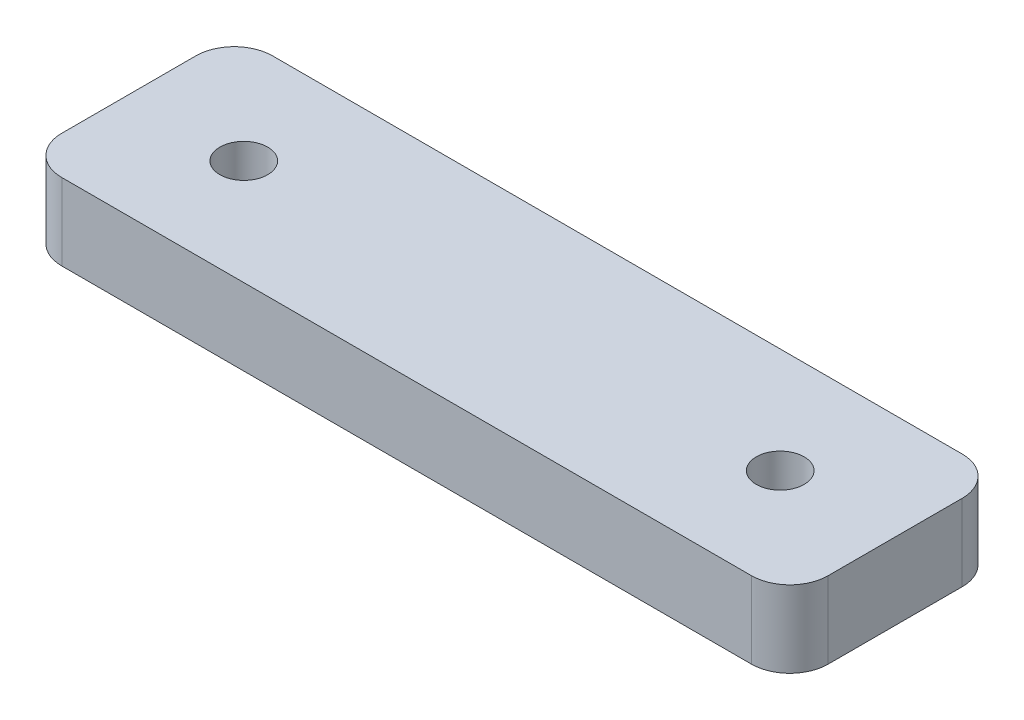
ISO-10303-21;
HEADER;
FILE_DESCRIPTION(('STEP AP214'),'2;1');
FILE_NAME('part.step','',(''),(''),'','','');
FILE_SCHEMA(('AUTOMOTIVE_DESIGN { 1 0 10303 214 1 1 1 1 }'));
ENDSEC;
DATA;
#1=APPLICATION_CONTEXT('core data for automotive mechanical design processes');
#2=APPLICATION_PROTOCOL_DEFINITION('international standard','automotive_design',2000,#1);
#3=PRODUCT_CONTEXT('',#1,'mechanical');
#4=PRODUCT('Part','Part','',(#3));
#5=PRODUCT_RELATED_PRODUCT_CATEGORY('part','',(#4));
#6=PRODUCT_DEFINITION_FORMATION('','',#4);
#7=PRODUCT_DEFINITION_CONTEXT('part definition',#1,'design');
#8=PRODUCT_DEFINITION('design','',#6,#7);
#9=PRODUCT_DEFINITION_SHAPE('','',#8);
#10=(LENGTH_UNIT() NAMED_UNIT(*) SI_UNIT(.MILLI.,.METRE.));
#11=(NAMED_UNIT(*) PLANE_ANGLE_UNIT() SI_UNIT($,.RADIAN.));
#12=(NAMED_UNIT(*) SI_UNIT($,.STERADIAN.) SOLID_ANGLE_UNIT());
#13=UNCERTAINTY_MEASURE_WITH_UNIT(LENGTH_MEASURE(1.E-05),#10,'distance_accuracy_value','');
#14=(GEOMETRIC_REPRESENTATION_CONTEXT(3) GLOBAL_UNCERTAINTY_ASSIGNED_CONTEXT((#13)) GLOBAL_UNIT_ASSIGNED_CONTEXT((#10,
#11,#12)) REPRESENTATION_CONTEXT('',''));
#15=CARTESIAN_POINT('',(0.,0.,0.));
#16=DIRECTION('',(0.,0.,1.));
#17=DIRECTION('',(1.,0.,0.));
#18=AXIS2_PLACEMENT_3D('',#15,#16,#17);
#19=CARTESIAN_POINT('',(0.,2.,0.));
#20=DIRECTION('',(0.,-1.,0.));
#21=DIRECTION('',(0.,0.,-1.));
#22=AXIS2_PLACEMENT_3D('',#19,#20,#21);
#23=PLANE('',#22);
#24=DIRECTION('',(0.,0.,-1.));
#25=VECTOR('',#24,1.);
#26=CARTESIAN_POINT('',(9.99999999999999,2.,2.75));
#27=LINE('',#26,#25);
#28=CARTESIAN_POINT('',(9.99999999999999,2.,1.75));
#29=VERTEX_POINT('',#28);
#30=CARTESIAN_POINT('',(9.99999999999999,2.,-1.75));
#31=VERTEX_POINT('',#30);
#32=EDGE_CURVE('E139',#29,#31,#27,.T.);
#33=ORIENTED_EDGE('',*,*,#32,.T.);
#34=CARTESIAN_POINT('',(8.99999999999999,2.,-1.75));
#35=DIRECTION('',(0.,-1.,0.));
#36=DIRECTION('',(0.,0.,-1.));
#37=AXIS2_PLACEMENT_3D('',#34,#35,#36);
#38=CIRCLE('',#37,1.);
#39=CARTESIAN_POINT('',(8.99999999999999,2.,-2.75));
#40=VERTEX_POINT('',#39);
#41=EDGE_CURVE('E153',#31,#40,#38,.F.);
#42=ORIENTED_EDGE('',*,*,#41,.T.);
#43=DIRECTION('',(-1.,0.,0.));
#44=VECTOR('',#43,1.);
#45=CARTESIAN_POINT('',(-10.,2.,-2.75));
#46=LINE('',#45,#44);
#47=CARTESIAN_POINT('',(-9.00000000000001,2.,-2.75));
#48=VERTEX_POINT('',#47);
#49=EDGE_CURVE('E120',#40,#48,#46,.T.);
#50=ORIENTED_EDGE('',*,*,#49,.T.);
#51=CARTESIAN_POINT('',(-9.00000000000001,2.,-1.75));
#52=DIRECTION('',(0.,-1.,0.));
#53=DIRECTION('',(0.,0.,-1.));
#54=AXIS2_PLACEMENT_3D('',#51,#52,#53);
#55=CIRCLE('',#54,1.);
#56=CARTESIAN_POINT('',(-10.,2.,-1.75));
#57=VERTEX_POINT('',#56);
#58=EDGE_CURVE('E149',#48,#57,#55,.F.);
#59=ORIENTED_EDGE('',*,*,#58,.T.);
#60=DIRECTION('',(0.,0.,1.));
#61=VECTOR('',#60,1.);
#62=CARTESIAN_POINT('',(-10.,2.,2.75));
#63=LINE('',#62,#61);
#64=CARTESIAN_POINT('',(-10.,2.,1.75));
#65=VERTEX_POINT('',#64);
#66=EDGE_CURVE('E162',#57,#65,#63,.T.);
#67=ORIENTED_EDGE('',*,*,#66,.T.);
#68=CARTESIAN_POINT('',(-9.00000000000001,2.,1.75));
#69=DIRECTION('',(0.,-1.,0.));
#70=DIRECTION('',(0.,0.,-1.));
#71=AXIS2_PLACEMENT_3D('',#68,#69,#70);
#72=CIRCLE('',#71,1.);
#73=CARTESIAN_POINT('',(-9.00000000000001,2.,2.75));
#74=VERTEX_POINT('',#73);
#75=EDGE_CURVE('E55',#65,#74,#72,.F.);
#76=ORIENTED_EDGE('',*,*,#75,.T.);
#77=DIRECTION('',(1.,0.,0.));
#78=VECTOR('',#77,1.);
#79=CARTESIAN_POINT('',(-10.,2.,2.75));
#80=LINE('',#79,#78);
#81=CARTESIAN_POINT('',(8.99999999999999,2.,2.75));
#82=VERTEX_POINT('',#81);
#83=EDGE_CURVE('E140',#74,#82,#80,.T.);
#84=ORIENTED_EDGE('',*,*,#83,.T.);
#85=CARTESIAN_POINT('',(8.99999999999999,2.,1.75));
#86=DIRECTION('',(0.,-1.,0.));
#87=DIRECTION('',(0.,0.,-1.));
#88=AXIS2_PLACEMENT_3D('',#85,#86,#87);
#89=CIRCLE('',#88,1.);
#90=EDGE_CURVE('E151',#82,#29,#89,.F.);
#91=ORIENTED_EDGE('',*,*,#90,.T.);
#92=EDGE_LOOP('',(#33,#42,#50,#59,#67,#76,#84,#91));
#93=FACE_BOUND('',#92,.T.);
#94=CARTESIAN_POINT('',(-7.00000000000001,2.,0.));
#95=DIRECTION('',(0.,1.,0.));
#96=DIRECTION('',(0.,0.,1.));
#97=AXIS2_PLACEMENT_3D('',#94,#95,#96);
#98=CIRCLE('',#97,0.625000000000001);
#99=CARTESIAN_POINT('',(-7.00000000000001,2.,0.625000000000001));
#100=VERTEX_POINT('',#99);
#101=EDGE_CURVE('E134',#100,#100,#98,.T.);
#102=ORIENTED_EDGE('',*,*,#101,.F.);
#103=EDGE_LOOP('',(#102));
#104=FACE_BOUND('',#103,.T.);
#105=CARTESIAN_POINT('',(7.00000000000001,2.,0.));
#106=DIRECTION('',(0.,1.,0.));
#107=DIRECTION('',(0.,0.,-1.));
#108=AXIS2_PLACEMENT_3D('',#105,#106,#107);
#109=CIRCLE('',#108,0.625000000000001);
#110=CARTESIAN_POINT('',(7.00000000000001,2.,-0.625000000000001));
#111=VERTEX_POINT('',#110);
#112=EDGE_CURVE('E185',#111,#111,#109,.T.);
#113=ORIENTED_EDGE('',*,*,#112,.F.);
#114=EDGE_LOOP('',(#113));
#115=FACE_BOUND('',#114,.T.);
#116=ADVANCED_FACE('F33',(#93,#104,#115),#23,.F.);
#117=CARTESIAN_POINT('',(0.,0.,0.));
#118=DIRECTION('',(0.,-1.,0.));
#119=DIRECTION('',(0.,0.,-1.));
#120=AXIS2_PLACEMENT_3D('',#117,#118,#119);
#121=PLANE('',#120);
#122=CARTESIAN_POINT('',(-7.00000000000001,0.,0.));
#123=DIRECTION('',(0.,1.,0.));
#124=DIRECTION('',(0.,0.,1.));
#125=AXIS2_PLACEMENT_3D('',#122,#123,#124);
#126=CIRCLE('',#125,0.625000000000001);
#127=CARTESIAN_POINT('',(-7.00000000000001,0.,0.625000000000001));
#128=VERTEX_POINT('',#127);
#129=EDGE_CURVE('E182',#128,#128,#126,.T.);
#130=ORIENTED_EDGE('',*,*,#129,.T.);
#131=EDGE_LOOP('',(#130));
#132=FACE_BOUND('',#131,.T.);
#133=DIRECTION('',(-1.,0.,0.));
#134=VECTOR('',#133,1.);
#135=CARTESIAN_POINT('',(-10.,0.,-2.75));
#136=LINE('',#135,#134);
#137=CARTESIAN_POINT('',(8.99999999999999,0.,-2.75));
#138=VERTEX_POINT('',#137);
#139=CARTESIAN_POINT('',(-9.00000000000001,0.,-2.75));
#140=VERTEX_POINT('',#139);
#141=EDGE_CURVE('E117',#138,#140,#136,.T.);
#142=ORIENTED_EDGE('',*,*,#141,.F.);
#143=CARTESIAN_POINT('',(8.99999999999999,0.,-1.75));
#144=DIRECTION('',(0.,-1.,0.));
#145=DIRECTION('',(0.,0.,-1.));
#146=AXIS2_PLACEMENT_3D('',#143,#144,#145);
#147=CIRCLE('',#146,1.);
#148=CARTESIAN_POINT('',(9.99999999999999,0.,-1.75));
#149=VERTEX_POINT('',#148);
#150=EDGE_CURVE('E100',#138,#149,#147,.T.);
#151=ORIENTED_EDGE('',*,*,#150,.T.);
#152=DIRECTION('',(0.,0.,-1.));
#153=VECTOR('',#152,1.);
#154=CARTESIAN_POINT('',(9.99999999999999,0.,2.75));
#155=LINE('',#154,#153);
#156=CARTESIAN_POINT('',(9.99999999999999,0.,1.75));
#157=VERTEX_POINT('',#156);
#158=EDGE_CURVE('E129',#157,#149,#155,.T.);
#159=ORIENTED_EDGE('',*,*,#158,.F.);
#160=CARTESIAN_POINT('',(8.99999999999999,0.,1.75));
#161=DIRECTION('',(0.,-1.,0.));
#162=DIRECTION('',(0.,0.,-1.));
#163=AXIS2_PLACEMENT_3D('',#160,#161,#162);
#164=CIRCLE('',#163,1.);
#165=CARTESIAN_POINT('',(8.99999999999999,0.,2.75));
#166=VERTEX_POINT('',#165);
#167=EDGE_CURVE('E111',#157,#166,#164,.T.);
#168=ORIENTED_EDGE('',*,*,#167,.T.);
#169=DIRECTION('',(1.,0.,0.));
#170=VECTOR('',#169,1.);
#171=CARTESIAN_POINT('',(-10.,0.,2.75));
#172=LINE('',#171,#170);
#173=CARTESIAN_POINT('',(-9.00000000000001,0.,2.75));
#174=VERTEX_POINT('',#173);
#175=EDGE_CURVE('E132',#174,#166,#172,.T.);
#176=ORIENTED_EDGE('',*,*,#175,.F.);
#177=CARTESIAN_POINT('',(-9.00000000000001,0.,1.75));
#178=DIRECTION('',(0.,-1.,0.));
#179=DIRECTION('',(0.,0.,-1.));
#180=AXIS2_PLACEMENT_3D('',#177,#178,#179);
#181=CIRCLE('',#180,1.);
#182=CARTESIAN_POINT('',(-10.,0.,1.75));
#183=VERTEX_POINT('',#182);
#184=EDGE_CURVE('E121',#174,#183,#181,.T.);
#185=ORIENTED_EDGE('',*,*,#184,.T.);
#186=DIRECTION('',(0.,0.,1.));
#187=VECTOR('',#186,1.);
#188=CARTESIAN_POINT('',(-10.,0.,2.75));
#189=LINE('',#188,#187);
#190=CARTESIAN_POINT('',(-10.,0.,-1.75));
#191=VERTEX_POINT('',#190);
#192=EDGE_CURVE('E128',#191,#183,#189,.T.);
#193=ORIENTED_EDGE('',*,*,#192,.F.);
#194=CARTESIAN_POINT('',(-9.00000000000001,0.,-1.75));
#195=DIRECTION('',(0.,-1.,0.));
#196=DIRECTION('',(0.,0.,-1.));
#197=AXIS2_PLACEMENT_3D('',#194,#195,#196);
#198=CIRCLE('',#197,1.);
#199=EDGE_CURVE('E127',#191,#140,#198,.T.);
#200=ORIENTED_EDGE('',*,*,#199,.T.);
#201=EDGE_LOOP('',(#142,#151,#159,#168,#176,#185,#193,#200));
#202=FACE_BOUND('',#201,.T.);
#203=CARTESIAN_POINT('',(7.00000000000001,0.,0.));
#204=DIRECTION('',(0.,1.,0.));
#205=DIRECTION('',(0.,0.,-1.));
#206=AXIS2_PLACEMENT_3D('',#203,#204,#205);
#207=CIRCLE('',#206,0.625000000000001);
#208=CARTESIAN_POINT('',(7.00000000000001,0.,-0.625000000000001));
#209=VERTEX_POINT('',#208);
#210=EDGE_CURVE('E188',#209,#209,#207,.T.);
#211=ORIENTED_EDGE('',*,*,#210,.T.);
#212=EDGE_LOOP('',(#211));
#213=FACE_BOUND('',#212,.T.);
#214=ADVANCED_FACE('F124',(#132,#202,#213),#121,.T.);
#215=CARTESIAN_POINT('',(9.99999999999999,2.,2.75));
#216=DIRECTION('',(-1.,0.,0.));
#217=DIRECTION('',(0.,0.,1.));
#218=AXIS2_PLACEMENT_3D('',#215,#216,#217);
#219=PLANE('',#218);
#220=ORIENTED_EDGE('',*,*,#158,.T.);
#221=DIRECTION('',(0.,-1.,0.));
#222=VECTOR('',#221,1.);
#223=CARTESIAN_POINT('',(9.99999999999999,2.,-1.75));
#224=LINE('',#223,#222);
#225=EDGE_CURVE('E105',#149,#31,#224,.F.);
#226=ORIENTED_EDGE('',*,*,#225,.T.);
#227=ORIENTED_EDGE('',*,*,#32,.F.);
#228=DIRECTION('',(0.,-1.,0.));
#229=VECTOR('',#228,1.);
#230=CARTESIAN_POINT('',(9.99999999999999,2.,1.75));
#231=LINE('',#230,#229);
#232=EDGE_CURVE('E110',#29,#157,#231,.T.);
#233=ORIENTED_EDGE('',*,*,#232,.T.);
#234=EDGE_LOOP('',(#220,#226,#227,#233));
#235=FACE_BOUND('',#234,.T.);
#236=ADVANCED_FACE('F178',(#235),#219,.F.);
#237=CARTESIAN_POINT('',(-10.,2.,-2.75));
#238=DIRECTION('',(0.,0.,1.));
#239=DIRECTION('',(1.,0.,0.));
#240=AXIS2_PLACEMENT_3D('',#237,#238,#239);
#241=PLANE('',#240);
#242=ORIENTED_EDGE('',*,*,#49,.F.);
#243=DIRECTION('',(0.,-1.,0.));
#244=VECTOR('',#243,1.);
#245=CARTESIAN_POINT('',(8.99999999999999,2.,-2.75));
#246=LINE('',#245,#244);
#247=EDGE_CURVE('E104',#40,#138,#246,.T.);
#248=ORIENTED_EDGE('',*,*,#247,.T.);
#249=ORIENTED_EDGE('',*,*,#141,.T.);
#250=DIRECTION('',(0.,-1.,0.));
#251=VECTOR('',#250,1.);
#252=CARTESIAN_POINT('',(-9.00000000000001,2.,-2.75));
#253=LINE('',#252,#251);
#254=EDGE_CURVE('E122',#140,#48,#253,.F.);
#255=ORIENTED_EDGE('',*,*,#254,.T.);
#256=EDGE_LOOP('',(#242,#248,#249,#255));
#257=FACE_BOUND('',#256,.T.);
#258=ADVANCED_FACE('F116',(#257),#241,.F.);
#259=CARTESIAN_POINT('',(-10.,2.,2.75));
#260=DIRECTION('',(1.,0.,0.));
#261=DIRECTION('',(0.,0.,-1.));
#262=AXIS2_PLACEMENT_3D('',#259,#260,#261);
#263=PLANE('',#262);
#264=ORIENTED_EDGE('',*,*,#66,.F.);
#265=DIRECTION('',(0.,-1.,0.));
#266=VECTOR('',#265,1.);
#267=CARTESIAN_POINT('',(-10.,2.,-1.75));
#268=LINE('',#267,#266);
#269=EDGE_CURVE('E11',#57,#191,#268,.T.);
#270=ORIENTED_EDGE('',*,*,#269,.T.);
#271=ORIENTED_EDGE('',*,*,#192,.T.);
#272=DIRECTION('',(0.,-1.,0.));
#273=VECTOR('',#272,1.);
#274=CARTESIAN_POINT('',(-10.,2.,1.75));
#275=LINE('',#274,#273);
#276=EDGE_CURVE('E41',#183,#65,#275,.F.);
#277=ORIENTED_EDGE('',*,*,#276,.T.);
#278=EDGE_LOOP('',(#264,#270,#271,#277));
#279=FACE_BOUND('',#278,.T.);
#280=ADVANCED_FACE('F161',(#279),#263,.F.);
#281=CARTESIAN_POINT('',(-10.,2.,2.75));
#282=DIRECTION('',(0.,0.,-1.));
#283=DIRECTION('',(-1.,0.,0.));
#284=AXIS2_PLACEMENT_3D('',#281,#282,#283);
#285=PLANE('',#284);
#286=ORIENTED_EDGE('',*,*,#175,.T.);
#287=DIRECTION('',(0.,-1.,0.));
#288=VECTOR('',#287,1.);
#289=CARTESIAN_POINT('',(8.99999999999999,2.,2.75));
#290=LINE('',#289,#288);
#291=EDGE_CURVE('E48',#166,#82,#290,.F.);
#292=ORIENTED_EDGE('',*,*,#291,.T.);
#293=ORIENTED_EDGE('',*,*,#83,.F.);
#294=DIRECTION('',(0.,-1.,0.));
#295=VECTOR('',#294,1.);
#296=CARTESIAN_POINT('',(-9.00000000000001,2.,2.75));
#297=LINE('',#296,#295);
#298=EDGE_CURVE('E155',#74,#174,#297,.T.);
#299=ORIENTED_EDGE('',*,*,#298,.T.);
#300=EDGE_LOOP('',(#286,#292,#293,#299));
#301=FACE_BOUND('',#300,.T.);
#302=ADVANCED_FACE('F171',(#301),#285,.F.);
#303=CARTESIAN_POINT('',(-7.00000000000001,2.,0.));
#304=DIRECTION('',(0.,-1.,0.));
#305=DIRECTION('',(0.,0.,-1.));
#306=AXIS2_PLACEMENT_3D('',#303,#304,#305);
#307=CYLINDRICAL_SURFACE('',#306,0.625000000000001);
#308=ORIENTED_EDGE('',*,*,#101,.T.);
#309=EDGE_LOOP('',(#308));
#310=FACE_BOUND('',#309,.T.);
#311=ORIENTED_EDGE('',*,*,#129,.F.);
#312=EDGE_LOOP('',(#311));
#313=FACE_BOUND('',#312,.T.);
#314=ADVANCED_FACE('F205',(#310,#313),#307,.F.);
#315=CARTESIAN_POINT('',(7.00000000000001,2.,0.));
#316=DIRECTION('',(0.,-1.,0.));
#317=DIRECTION('',(0.,0.,-1.));
#318=AXIS2_PLACEMENT_3D('',#315,#316,#317);
#319=CYLINDRICAL_SURFACE('',#318,0.625000000000001);
#320=ORIENTED_EDGE('',*,*,#112,.T.);
#321=EDGE_LOOP('',(#320));
#322=FACE_BOUND('',#321,.T.);
#323=ORIENTED_EDGE('',*,*,#210,.F.);
#324=EDGE_LOOP('',(#323));
#325=FACE_BOUND('',#324,.T.);
#326=ADVANCED_FACE('F194',(#322,#325),#319,.F.);
#327=CARTESIAN_POINT('',(8.99999999999999,2.,-1.75));
#328=DIRECTION('',(0.,-1.,0.));
#329=DIRECTION('',(0.,0.,-1.));
#330=AXIS2_PLACEMENT_3D('',#327,#328,#329);
#331=CYLINDRICAL_SURFACE('',#330,1.);
#332=ORIENTED_EDGE('',*,*,#41,.F.);
#333=ORIENTED_EDGE('',*,*,#225,.F.);
#334=ORIENTED_EDGE('',*,*,#150,.F.);
#335=ORIENTED_EDGE('',*,*,#247,.F.);
#336=EDGE_LOOP('',(#332,#333,#334,#335));
#337=FACE_BOUND('',#336,.T.);
#338=ADVANCED_FACE('F103',(#337),#331,.T.);
#339=CARTESIAN_POINT('',(8.99999999999999,2.,1.75));
#340=DIRECTION('',(0.,-1.,0.));
#341=DIRECTION('',(0.,0.,-1.));
#342=AXIS2_PLACEMENT_3D('',#339,#340,#341);
#343=CYLINDRICAL_SURFACE('',#342,1.);
#344=ORIENTED_EDGE('',*,*,#90,.F.);
#345=ORIENTED_EDGE('',*,*,#291,.F.);
#346=ORIENTED_EDGE('',*,*,#167,.F.);
#347=ORIENTED_EDGE('',*,*,#232,.F.);
#348=EDGE_LOOP('',(#344,#345,#346,#347));
#349=FACE_BOUND('',#348,.T.);
#350=ADVANCED_FACE('F175',(#349),#343,.T.);
#351=CARTESIAN_POINT('',(-9.00000000000001,2.,-1.75));
#352=DIRECTION('',(0.,-1.,0.));
#353=DIRECTION('',(0.,0.,-1.));
#354=AXIS2_PLACEMENT_3D('',#351,#352,#353);
#355=CYLINDRICAL_SURFACE('',#354,1.);
#356=ORIENTED_EDGE('',*,*,#58,.F.);
#357=ORIENTED_EDGE('',*,*,#254,.F.);
#358=ORIENTED_EDGE('',*,*,#199,.F.);
#359=ORIENTED_EDGE('',*,*,#269,.F.);
#360=EDGE_LOOP('',(#356,#357,#358,#359));
#361=FACE_BOUND('',#360,.T.);
#362=ADVANCED_FACE('F219',(#361),#355,.T.);
#363=CARTESIAN_POINT('',(-9.00000000000001,2.,1.75));
#364=DIRECTION('',(0.,-1.,0.));
#365=DIRECTION('',(0.,0.,-1.));
#366=AXIS2_PLACEMENT_3D('',#363,#364,#365);
#367=CYLINDRICAL_SURFACE('',#366,1.);
#368=ORIENTED_EDGE('',*,*,#75,.F.);
#369=ORIENTED_EDGE('',*,*,#276,.F.);
#370=ORIENTED_EDGE('',*,*,#184,.F.);
#371=ORIENTED_EDGE('',*,*,#298,.F.);
#372=EDGE_LOOP('',(#368,#369,#370,#371));
#373=FACE_BOUND('',#372,.T.);
#374=ADVANCED_FACE('F35',(#373),#367,.T.);
#375=CLOSED_SHELL('',(#116,#214,#236,#258,#280,#302,#314,#326,#338,#350,#362,#374));
#376=MANIFOLD_SOLID_BREP('B2',#375);
#377=ADVANCED_BREP_SHAPE_REPRESENTATION('',(#18,#376),#14);
#378=SHAPE_DEFINITION_REPRESENTATION(#9,#377);
ENDSEC;
END-ISO-10303-21;
